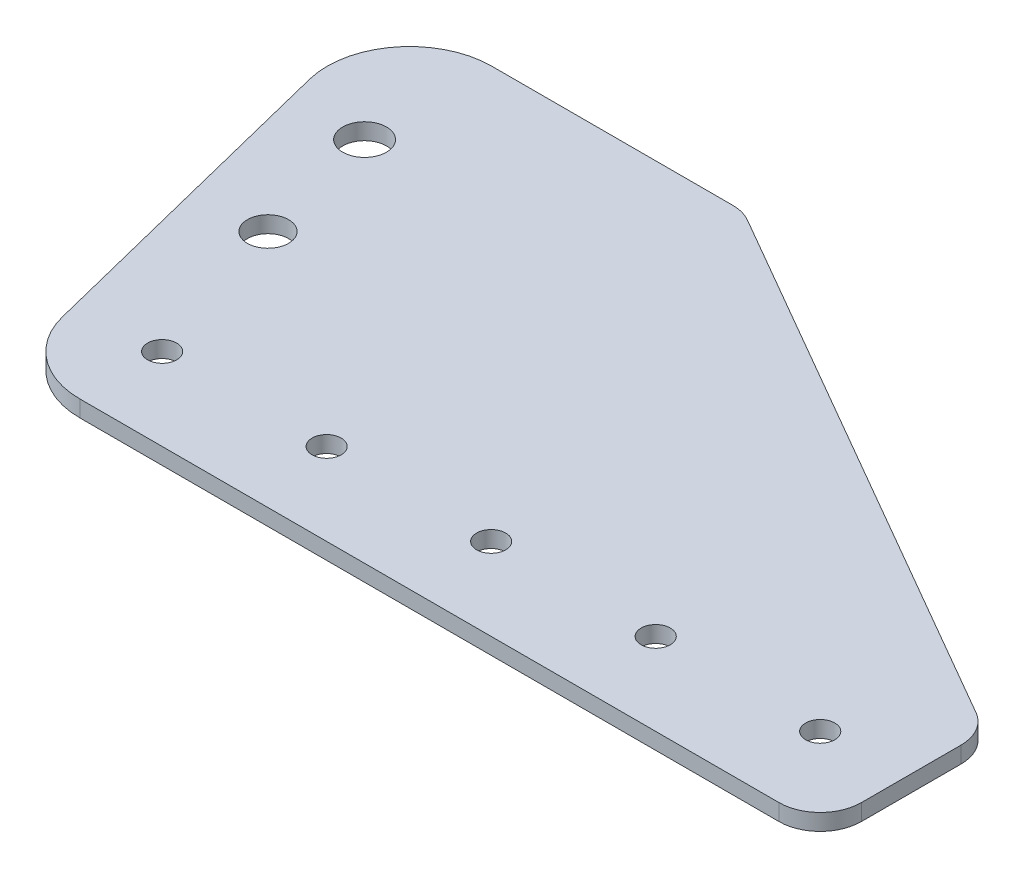
ISO-10303-21;
HEADER;
FILE_DESCRIPTION(('STEP AP214'),'2;1');
FILE_NAME('part.step','',(''),(''),'','','');
FILE_SCHEMA(('AUTOMOTIVE_DESIGN { 1 0 10303 214 1 1 1 1 }'));
ENDSEC;
DATA;
#1=APPLICATION_CONTEXT('core data for automotive mechanical design processes');
#2=APPLICATION_PROTOCOL_DEFINITION('international standard','automotive_design',2000,#1);
#3=PRODUCT_CONTEXT('',#1,'mechanical');
#4=PRODUCT('Part','Part','',(#3));
#5=PRODUCT_RELATED_PRODUCT_CATEGORY('part','',(#4));
#6=PRODUCT_DEFINITION_FORMATION('','',#4);
#7=PRODUCT_DEFINITION_CONTEXT('part definition',#1,'design');
#8=PRODUCT_DEFINITION('design','',#6,#7);
#9=PRODUCT_DEFINITION_SHAPE('','',#8);
#10=(LENGTH_UNIT() NAMED_UNIT(*) SI_UNIT(.MILLI.,.METRE.));
#11=(NAMED_UNIT(*) PLANE_ANGLE_UNIT() SI_UNIT($,.RADIAN.));
#12=(NAMED_UNIT(*) SI_UNIT($,.STERADIAN.) SOLID_ANGLE_UNIT());
#13=UNCERTAINTY_MEASURE_WITH_UNIT(LENGTH_MEASURE(1.E-05),#10,'distance_accuracy_value','');
#14=(GEOMETRIC_REPRESENTATION_CONTEXT(3) GLOBAL_UNCERTAINTY_ASSIGNED_CONTEXT((#13)) GLOBAL_UNIT_ASSIGNED_CONTEXT((#10,
#11,#12)) REPRESENTATION_CONTEXT('',''));
#15=CARTESIAN_POINT('',(0.,0.,0.));
#16=DIRECTION('',(0.,0.,1.));
#17=DIRECTION('',(1.,0.,0.));
#18=AXIS2_PLACEMENT_3D('',#15,#16,#17);
#19=CARTESIAN_POINT('',(127.,2.54,12.6999999999827));
#20=DIRECTION('',(-1.,0.,0.));
#21=DIRECTION('',(0.,0.,1.));
#22=AXIS2_PLACEMENT_3D('',#19,#20,#21);
#23=PLANE('',#22);
#24=DIRECTION('',(0.,0.,-1.));
#25=VECTOR('',#24,1.);
#26=CARTESIAN_POINT('',(127.,2.54,12.6999999999827));
#27=LINE('',#26,#25);
#28=CARTESIAN_POINT('',(127.,2.54,6.34999999998268));
#29=VERTEX_POINT('',#28);
#30=CARTESIAN_POINT('',(127.,2.54,-9.03382579066318));
#31=VERTEX_POINT('',#30);
#32=EDGE_CURVE('E204',#29,#31,#27,.T.);
#33=ORIENTED_EDGE('',*,*,#32,.F.);
#34=DIRECTION('',(0.,-1.,0.));
#35=VECTOR('',#34,1.);
#36=CARTESIAN_POINT('',(127.,2.54,6.34999999998268));
#37=LINE('',#36,#35);
#38=CARTESIAN_POINT('',(127.,0.,6.34999999998268));
#39=VERTEX_POINT('',#38);
#40=EDGE_CURVE('E216',#29,#39,#37,.T.);
#41=ORIENTED_EDGE('',*,*,#40,.T.);
#42=DIRECTION('',(0.,0.,-1.));
#43=VECTOR('',#42,1.);
#44=CARTESIAN_POINT('',(127.,0.,12.6999999999827));
#45=LINE('',#44,#43);
#46=CARTESIAN_POINT('',(127.,0.,-9.03382579066318));
#47=VERTEX_POINT('',#46);
#48=EDGE_CURVE('E181',#39,#47,#45,.T.);
#49=ORIENTED_EDGE('',*,*,#48,.T.);
#50=DIRECTION('',(0.,-1.,0.));
#51=VECTOR('',#50,1.);
#52=CARTESIAN_POINT('',(127.,2.54,-9.03382579066318));
#53=LINE('',#52,#51);
#54=EDGE_CURVE('E158',#47,#31,#53,.F.);
#55=ORIENTED_EDGE('',*,*,#54,.T.);
#56=EDGE_LOOP('',(#33,#41,#49,#55));
#57=FACE_BOUND('',#56,.T.);
#58=ADVANCED_FACE('F41',(#57),#23,.F.);
#59=CARTESIAN_POINT('',(38.8574034597005,2.54,-63.5891518396311));
#60=DIRECTION('',(-0.499999999999995,0.,0.866025403784442));
#61=DIRECTION('',(0.866025403784442,0.,0.499999999999995));
#62=AXIS2_PLACEMENT_3D('',#59,#60,#61);
#63=PLANE('',#62);
#64=DIRECTION('',(-0.866025403784442,0.,-0.499999999999995));
#65=VECTOR('',#64,1.);
#66=CARTESIAN_POINT('',(38.8574034597005,2.54,-63.5891518396311));
#67=LINE('',#66,#65);
#68=CARTESIAN_POINT('',(123.825,2.54,-14.5330871046944));
#69=VERTEX_POINT('',#68);
#70=CARTESIAN_POINT('',(40.3309260877629,2.54,-62.7384131536623));
#71=VERTEX_POINT('',#70);
#72=EDGE_CURVE('E148',#69,#71,#67,.T.);
#73=ORIENTED_EDGE('',*,*,#72,.F.);
#74=DIRECTION('',(0.,-1.,0.));
#75=VECTOR('',#74,1.);
#76=CARTESIAN_POINT('',(123.825,2.54,-14.5330871046944));
#77=LINE('',#76,#75);
#78=CARTESIAN_POINT('',(123.825,0.,-14.5330871046944));
#79=VERTEX_POINT('',#78);
#80=EDGE_CURVE('E50',#69,#79,#77,.T.);
#81=ORIENTED_EDGE('',*,*,#80,.T.);
#82=DIRECTION('',(-0.866025403784442,0.,-0.499999999999995));
#83=VECTOR('',#82,1.);
#84=CARTESIAN_POINT('',(38.8574034597005,0.,-63.5891518396311));
#85=LINE('',#84,#83);
#86=CARTESIAN_POINT('',(40.3309260877629,0.,-62.7384131536623));
#87=VERTEX_POINT('',#86);
#88=EDGE_CURVE('E185',#79,#87,#85,.T.);
#89=ORIENTED_EDGE('',*,*,#88,.T.);
#90=DIRECTION('',(0.,-1.,0.));
#91=VECTOR('',#90,1.);
#92=CARTESIAN_POINT('',(40.3309260877629,2.54,-62.7384131536623));
#93=LINE('',#92,#91);
#94=EDGE_CURVE('E70',#87,#71,#93,.F.);
#95=ORIENTED_EDGE('',*,*,#94,.T.);
#96=EDGE_LOOP('',(#73,#81,#89,#95));
#97=FACE_BOUND('',#96,.T.);
#98=ADVANCED_FACE('F246',(#97),#63,.F.);
#99=CARTESIAN_POINT('',(0.,2.54,-63.5891518396311));
#100=DIRECTION('',(0.,0.,1.));
#101=DIRECTION('',(1.,0.,0.));
#102=AXIS2_PLACEMENT_3D('',#99,#100,#101);
#103=PLANE('',#102);
#104=DIRECTION('',(-1.,0.,0.));
#105=VECTOR('',#104,1.);
#106=CARTESIAN_POINT('',(0.,2.54,-63.5891518396311));
#107=LINE('',#106,#105);
#108=CARTESIAN_POINT('',(37.1559260877629,2.54,-63.5891518396311));
#109=VERTEX_POINT('',#108);
#110=CARTESIAN_POINT('',(0.,2.54,-63.5891518396311));
#111=VERTEX_POINT('',#110);
#112=EDGE_CURVE('E138',#109,#111,#107,.T.);
#113=ORIENTED_EDGE('',*,*,#112,.F.);
#114=DIRECTION('',(0.,-1.,0.));
#115=VECTOR('',#114,1.);
#116=CARTESIAN_POINT('',(37.1559260877629,2.54,-63.5891518396311));
#117=LINE('',#116,#115);
#118=CARTESIAN_POINT('',(37.1559260877629,0.,-63.5891518396311));
#119=VERTEX_POINT('',#118);
#120=EDGE_CURVE('E11',#109,#119,#117,.T.);
#121=ORIENTED_EDGE('',*,*,#120,.T.);
#122=DIRECTION('',(-1.,0.,0.));
#123=VECTOR('',#122,1.);
#124=CARTESIAN_POINT('',(0.,0.,-63.5891518396311));
#125=LINE('',#124,#123);
#126=CARTESIAN_POINT('',(0.,0.,-63.5891518396311));
#127=VERTEX_POINT('',#126);
#128=EDGE_CURVE('E154',#119,#127,#125,.T.);
#129=ORIENTED_EDGE('',*,*,#128,.T.);
#130=DIRECTION('',(0.,-1.,0.));
#131=VECTOR('',#130,1.);
#132=CARTESIAN_POINT('',(0.,2.54,-63.5891518396311));
#133=LINE('',#132,#131);
#134=EDGE_CURVE('E151',#111,#127,#133,.T.);
#135=ORIENTED_EDGE('',*,*,#134,.F.);
#136=EDGE_LOOP('',(#113,#121,#129,#135));
#137=FACE_BOUND('',#136,.T.);
#138=ADVANCED_FACE('F152',(#137),#103,.F.);
#139=CARTESIAN_POINT('',(0.,2.54,-50.8891518396311));
#140=DIRECTION('',(0.,-1.,0.));
#141=DIRECTION('',(0.,0.,-1.));
#142=AXIS2_PLACEMENT_3D('',#139,#140,#141);
#143=CYLINDRICAL_SURFACE('',#142,12.7);
#144=CARTESIAN_POINT('',(0.,0.,-50.8891518396311));
#145=DIRECTION('',(0.,1.,0.));
#146=DIRECTION('',(0.,0.,1.));
#147=AXIS2_PLACEMENT_3D('',#144,#145,#146);
#148=CIRCLE('',#147,12.7);
#149=CARTESIAN_POINT('',(-12.3220785189887,0.,-47.8140289198316));
#150=VERTEX_POINT('',#149);
#151=EDGE_CURVE('E191',#127,#150,#148,.T.);
#152=ORIENTED_EDGE('',*,*,#151,.T.);
#153=DIRECTION('',(0.,-1.,0.));
#154=VECTOR('',#153,1.);
#155=CARTESIAN_POINT('',(-12.3220785189887,2.54,-47.8140289198316));
#156=LINE('',#155,#154);
#157=CARTESIAN_POINT('',(-12.3220785189887,2.54,-47.8140289198316));
#158=VERTEX_POINT('',#157);
#159=EDGE_CURVE('E159',#158,#150,#156,.T.);
#160=ORIENTED_EDGE('',*,*,#159,.F.);
#161=CARTESIAN_POINT('',(0.,2.54,-50.8891518396311));
#162=DIRECTION('',(0.,1.,0.));
#163=DIRECTION('',(0.,0.,1.));
#164=AXIS2_PLACEMENT_3D('',#161,#162,#163);
#165=CIRCLE('',#164,12.7);
#166=EDGE_CURVE('E143',#111,#158,#165,.T.);
#167=ORIENTED_EDGE('',*,*,#166,.F.);
#168=ORIENTED_EDGE('',*,*,#134,.T.);
#169=EDGE_LOOP('',(#152,#160,#167,#168));
#170=FACE_BOUND('',#169,.T.);
#171=ADVANCED_FACE('F161',(#170),#143,.T.);
#172=CARTESIAN_POINT('',(-12.3220785189887,2.54,-47.8140289198316));
#173=DIRECTION('',(0.970242403069978,0.,-0.242135662976344));
#174=DIRECTION('',(-0.242135662976344,0.,-0.970242403069978));
#175=AXIS2_PLACEMENT_3D('',#172,#173,#174);
#176=PLANE('',#175);
#177=DIRECTION('',(0.242135662976344,0.,0.970242403069978));
#178=VECTOR('',#177,1.);
#179=CARTESIAN_POINT('',(-12.3220785189887,0.,-47.8140289198316));
#180=LINE('',#179,#178);
#181=CARTESIAN_POINT('',(0.377921481011272,0.,3.07512291978227));
#182=VERTEX_POINT('',#181);
#183=EDGE_CURVE('E194',#150,#182,#180,.T.);
#184=ORIENTED_EDGE('',*,*,#183,.T.);
#185=DIRECTION('',(0.,-1.,0.));
#186=VECTOR('',#185,1.);
#187=CARTESIAN_POINT('',(0.377921481011272,2.54,3.07512291978227));
#188=LINE('',#187,#186);
#189=CARTESIAN_POINT('',(0.377921481011272,2.54,3.07512291978227));
#190=VERTEX_POINT('',#189);
#191=EDGE_CURVE('E208',#190,#182,#188,.T.);
#192=ORIENTED_EDGE('',*,*,#191,.F.);
#193=DIRECTION('',(0.242135662976344,0.,0.970242403069978));
#194=VECTOR('',#193,1.);
#195=CARTESIAN_POINT('',(-12.3220785189887,2.54,-47.8140289198316));
#196=LINE('',#195,#194);
#197=EDGE_CURVE('E165',#158,#190,#196,.T.);
#198=ORIENTED_EDGE('',*,*,#197,.F.);
#199=ORIENTED_EDGE('',*,*,#159,.T.);
#200=EDGE_LOOP('',(#184,#192,#198,#199));
#201=FACE_BOUND('',#200,.T.);
#202=ADVANCED_FACE('F388',(#201),#176,.F.);
#203=CARTESIAN_POINT('',(12.7,2.54,-1.73056013963446E-11));
#204=DIRECTION('',(0.,-1.,0.));
#205=DIRECTION('',(0.,0.,-1.));
#206=AXIS2_PLACEMENT_3D('',#203,#204,#205);
#207=CYLINDRICAL_SURFACE('',#206,12.7);
#208=CARTESIAN_POINT('',(12.7,0.,-1.73056013963446E-11));
#209=DIRECTION('',(0.,1.,0.));
#210=DIRECTION('',(0.,0.,-1.));
#211=AXIS2_PLACEMENT_3D('',#208,#209,#210);
#212=CIRCLE('',#211,12.7);
#213=CARTESIAN_POINT('',(12.7,0.,12.6999999999827));
#214=VERTEX_POINT('',#213);
#215=EDGE_CURVE('E197',#182,#214,#212,.T.);
#216=ORIENTED_EDGE('',*,*,#215,.T.);
#217=DIRECTION('',(0.,-1.,0.));
#218=VECTOR('',#217,1.);
#219=CARTESIAN_POINT('',(12.7,2.54,12.6999999999827));
#220=LINE('',#219,#218);
#221=CARTESIAN_POINT('',(12.7,2.54,12.6999999999827));
#222=VERTEX_POINT('',#221);
#223=EDGE_CURVE('E180',#222,#214,#220,.T.);
#224=ORIENTED_EDGE('',*,*,#223,.F.);
#225=CARTESIAN_POINT('',(12.7,2.54,-1.73056013963446E-11));
#226=DIRECTION('',(0.,1.,0.));
#227=DIRECTION('',(0.,0.,-1.));
#228=AXIS2_PLACEMENT_3D('',#225,#226,#227);
#229=CIRCLE('',#228,12.7);
#230=EDGE_CURVE('E171',#190,#222,#229,.T.);
#231=ORIENTED_EDGE('',*,*,#230,.F.);
#232=ORIENTED_EDGE('',*,*,#191,.T.);
#233=EDGE_LOOP('',(#216,#224,#231,#232));
#234=FACE_BOUND('',#233,.T.);
#235=ADVANCED_FACE('F384',(#234),#207,.T.);
#236=CARTESIAN_POINT('',(127.,2.54,12.6999999999827));
#237=DIRECTION('',(0.,0.,-1.));
#238=DIRECTION('',(-1.,0.,0.));
#239=AXIS2_PLACEMENT_3D('',#236,#237,#238);
#240=PLANE('',#239);
#241=DIRECTION('',(1.,0.,0.));
#242=VECTOR('',#241,1.);
#243=CARTESIAN_POINT('',(127.,0.,12.6999999999827));
#244=LINE('',#243,#242);
#245=CARTESIAN_POINT('',(120.65,0.,12.6999999999827));
#246=VERTEX_POINT('',#245);
#247=EDGE_CURVE('E200',#214,#246,#244,.T.);
#248=ORIENTED_EDGE('',*,*,#247,.T.);
#249=DIRECTION('',(0.,-1.,0.));
#250=VECTOR('',#249,1.);
#251=CARTESIAN_POINT('',(120.65,2.54,12.6999999999827));
#252=LINE('',#251,#250);
#253=CARTESIAN_POINT('',(120.65,2.54,12.6999999999827));
#254=VERTEX_POINT('',#253);
#255=EDGE_CURVE('E229',#246,#254,#252,.F.);
#256=ORIENTED_EDGE('',*,*,#255,.T.);
#257=DIRECTION('',(1.,0.,0.));
#258=VECTOR('',#257,1.);
#259=CARTESIAN_POINT('',(127.,2.54,12.6999999999827));
#260=LINE('',#259,#258);
#261=EDGE_CURVE('E177',#222,#254,#260,.T.);
#262=ORIENTED_EDGE('',*,*,#261,.F.);
#263=ORIENTED_EDGE('',*,*,#223,.T.);
#264=EDGE_LOOP('',(#248,#256,#262,#263));
#265=FACE_BOUND('',#264,.T.);
#266=ADVANCED_FACE('F352',(#265),#240,.F.);
#267=CARTESIAN_POINT('',(0.,2.54,-50.8891518396311));
#268=DIRECTION('',(0.,1.,0.));
#269=DIRECTION('',(0.,0.,1.));
#270=AXIS2_PLACEMENT_3D('',#267,#268,#269);
#271=PLANE('',#270);
#272=CARTESIAN_POINT('',(4.83277956991413,2.54,-24.2097000285141));
#273=DIRECTION('',(0.,1.,0.));
#274=DIRECTION('',(0.,0.,1.));
#275=AXIS2_PLACEMENT_3D('',#272,#273,#274);
#276=CIRCLE('',#275,3.175);
#277=CARTESIAN_POINT('',(4.83277956991413,2.54,-21.0347000285141));
#278=VERTEX_POINT('',#277);
#279=EDGE_CURVE('E338',#278,#278,#276,.T.);
#280=ORIENTED_EDGE('',*,*,#279,.F.);
#281=EDGE_LOOP('',(#280));
#282=FACE_BOUND('',#281,.T.);
#283=CARTESIAN_POINT('',(12.7,2.54,-1.73056013963446E-11));
#284=DIRECTION('',(0.,1.,0.));
#285=DIRECTION('',(0.,0.,1.));
#286=AXIS2_PLACEMENT_3D('',#283,#284,#285);
#287=CIRCLE('',#286,2.24789999999999);
#288=CARTESIAN_POINT('',(12.7,2.54,2.24789999998268));
#289=VERTEX_POINT('',#288);
#290=EDGE_CURVE('E333',#289,#289,#287,.T.);
#291=ORIENTED_EDGE('',*,*,#290,.F.);
#292=EDGE_LOOP('',(#291));
#293=FACE_BOUND('',#292,.T.);
#294=CARTESIAN_POINT('',(38.1,2.54,-1.73056013963446E-11));
#295=DIRECTION('',(0.,1.,0.));
#296=DIRECTION('',(0.,0.,1.));
#297=AXIS2_PLACEMENT_3D('',#294,#295,#296);
#298=CIRCLE('',#297,2.24789999999998);
#299=CARTESIAN_POINT('',(38.1,2.54,2.24789999998268));
#300=VERTEX_POINT('',#299);
#301=EDGE_CURVE('E325',#300,#300,#298,.T.);
#302=ORIENTED_EDGE('',*,*,#301,.F.);
#303=EDGE_LOOP('',(#302));
#304=FACE_BOUND('',#303,.T.);
#305=CARTESIAN_POINT('',(63.5,2.54,-1.73056013963446E-11));
#306=DIRECTION('',(0.,1.,0.));
#307=DIRECTION('',(0.,0.,1.));
#308=AXIS2_PLACEMENT_3D('',#305,#306,#307);
#309=CIRCLE('',#308,2.24789999999998);
#310=CARTESIAN_POINT('',(63.5,2.54,2.24789999998268));
#311=VERTEX_POINT('',#310);
#312=EDGE_CURVE('E317',#311,#311,#309,.T.);
#313=ORIENTED_EDGE('',*,*,#312,.F.);
#314=EDGE_LOOP('',(#313));
#315=FACE_BOUND('',#314,.T.);
#316=CARTESIAN_POINT('',(88.9,2.54,-1.73056013963446E-11));
#317=DIRECTION('',(0.,1.,0.));
#318=DIRECTION('',(0.,0.,1.));
#319=AXIS2_PLACEMENT_3D('',#316,#317,#318);
#320=CIRCLE('',#319,2.24789999999998);
#321=CARTESIAN_POINT('',(88.9,2.54,2.24789999998268));
#322=VERTEX_POINT('',#321);
#323=EDGE_CURVE('E309',#322,#322,#320,.T.);
#324=ORIENTED_EDGE('',*,*,#323,.F.);
#325=EDGE_LOOP('',(#324));
#326=FACE_BOUND('',#325,.T.);
#327=CARTESIAN_POINT('',(114.3,2.54,-1.73056013963446E-11));
#328=DIRECTION('',(0.,1.,0.));
#329=DIRECTION('',(0.,0.,1.));
#330=AXIS2_PLACEMENT_3D('',#327,#328,#329);
#331=CIRCLE('',#330,2.24789999999998);
#332=CARTESIAN_POINT('',(114.3,2.54,2.24789999998268));
#333=VERTEX_POINT('',#332);
#334=EDGE_CURVE('E301',#333,#333,#331,.T.);
#335=ORIENTED_EDGE('',*,*,#334,.F.);
#336=EDGE_LOOP('',(#335));
#337=FACE_BOUND('',#336,.T.);
#338=CARTESIAN_POINT('',(0.,2.54,-43.956848344882));
#339=DIRECTION('',(0.,1.,0.));
#340=DIRECTION('',(0.,0.,1.));
#341=AXIS2_PLACEMENT_3D('',#338,#339,#340);
#342=CIRCLE('',#341,3.3782);
#343=CARTESIAN_POINT('',(0.,2.54,-40.578648344882));
#344=VERTEX_POINT('',#343);
#345=EDGE_CURVE('E294',#344,#344,#342,.T.);
#346=ORIENTED_EDGE('',*,*,#345,.F.);
#347=EDGE_LOOP('',(#346));
#348=FACE_BOUND('',#347,.T.);
#349=ORIENTED_EDGE('',*,*,#261,.T.);
#350=CARTESIAN_POINT('',(120.65,2.54,6.34999999998268));
#351=DIRECTION('',(0.,1.,0.));
#352=DIRECTION('',(0.,0.,1.));
#353=AXIS2_PLACEMENT_3D('',#350,#351,#352);
#354=CIRCLE('',#353,6.35);
#355=EDGE_CURVE('E237',#254,#29,#354,.T.);
#356=ORIENTED_EDGE('',*,*,#355,.T.);
#357=ORIENTED_EDGE('',*,*,#32,.T.);
#358=CARTESIAN_POINT('',(120.65,2.54,-9.03382579066318));
#359=DIRECTION('',(0.,1.,0.));
#360=DIRECTION('',(0.,0.,1.));
#361=AXIS2_PLACEMENT_3D('',#358,#359,#360);
#362=CIRCLE('',#361,6.35);
#363=EDGE_CURVE('E234',#31,#69,#362,.T.);
#364=ORIENTED_EDGE('',*,*,#363,.T.);
#365=ORIENTED_EDGE('',*,*,#72,.T.);
#366=CARTESIAN_POINT('',(37.1559260877629,2.54,-57.2391518396311));
#367=DIRECTION('',(0.,1.,0.));
#368=DIRECTION('',(0.,0.,1.));
#369=AXIS2_PLACEMENT_3D('',#366,#367,#368);
#370=CIRCLE('',#369,6.35);
#371=EDGE_CURVE('E60',#71,#109,#370,.T.);
#372=ORIENTED_EDGE('',*,*,#371,.T.);
#373=ORIENTED_EDGE('',*,*,#112,.T.);
#374=ORIENTED_EDGE('',*,*,#166,.T.);
#375=ORIENTED_EDGE('',*,*,#197,.T.);
#376=ORIENTED_EDGE('',*,*,#230,.T.);
#377=EDGE_LOOP('',(#349,#356,#357,#364,#365,#372,#373,#374,#375,#376));
#378=FACE_BOUND('',#377,.T.);
#379=ADVANCED_FACE('F141',(#282,#293,#304,#315,#326,#337,#348,#378),#271,.T.);
#380=CARTESIAN_POINT('',(0.,0.,-50.8891518396311));
#381=DIRECTION('',(0.,1.,0.));
#382=DIRECTION('',(0.,0.,1.));
#383=AXIS2_PLACEMENT_3D('',#380,#381,#382);
#384=PLANE('',#383);
#385=CARTESIAN_POINT('',(4.83277956991413,0.,-24.2097000285141));
#386=DIRECTION('',(0.,1.,0.));
#387=DIRECTION('',(0.,0.,1.));
#388=AXIS2_PLACEMENT_3D('',#385,#386,#387);
#389=CIRCLE('',#388,3.175);
#390=CARTESIAN_POINT('',(4.83277956991413,0.,-21.0347000285141));
#391=VERTEX_POINT('',#390);
#392=EDGE_CURVE('E337',#391,#391,#389,.T.);
#393=ORIENTED_EDGE('',*,*,#392,.T.);
#394=EDGE_LOOP('',(#393));
#395=FACE_BOUND('',#394,.T.);
#396=CARTESIAN_POINT('',(12.7,0.,-1.73056013963446E-11));
#397=DIRECTION('',(0.,1.,0.));
#398=DIRECTION('',(0.,0.,1.));
#399=AXIS2_PLACEMENT_3D('',#396,#397,#398);
#400=CIRCLE('',#399,2.24789999999999);
#401=CARTESIAN_POINT('',(12.7,0.,2.24789999998268));
#402=VERTEX_POINT('',#401);
#403=EDGE_CURVE('E329',#402,#402,#400,.T.);
#404=ORIENTED_EDGE('',*,*,#403,.T.);
#405=EDGE_LOOP('',(#404));
#406=FACE_BOUND('',#405,.T.);
#407=CARTESIAN_POINT('',(38.1,0.,-1.73056013963446E-11));
#408=DIRECTION('',(0.,1.,0.));
#409=DIRECTION('',(0.,0.,1.));
#410=AXIS2_PLACEMENT_3D('',#407,#408,#409);
#411=CIRCLE('',#410,2.24789999999998);
#412=CARTESIAN_POINT('',(38.1,0.,2.24789999998268));
#413=VERTEX_POINT('',#412);
#414=EDGE_CURVE('E321',#413,#413,#411,.T.);
#415=ORIENTED_EDGE('',*,*,#414,.T.);
#416=EDGE_LOOP('',(#415));
#417=FACE_BOUND('',#416,.T.);
#418=CARTESIAN_POINT('',(63.5,0.,-1.73056013963446E-11));
#419=DIRECTION('',(0.,1.,0.));
#420=DIRECTION('',(0.,0.,1.));
#421=AXIS2_PLACEMENT_3D('',#418,#419,#420);
#422=CIRCLE('',#421,2.24789999999998);
#423=CARTESIAN_POINT('',(63.5,0.,2.24789999998268));
#424=VERTEX_POINT('',#423);
#425=EDGE_CURVE('E313',#424,#424,#422,.T.);
#426=ORIENTED_EDGE('',*,*,#425,.T.);
#427=EDGE_LOOP('',(#426));
#428=FACE_BOUND('',#427,.T.);
#429=CARTESIAN_POINT('',(88.9,0.,-1.73056013963446E-11));
#430=DIRECTION('',(0.,1.,0.));
#431=DIRECTION('',(0.,0.,1.));
#432=AXIS2_PLACEMENT_3D('',#429,#430,#431);
#433=CIRCLE('',#432,2.24789999999998);
#434=CARTESIAN_POINT('',(88.9,0.,2.24789999998268));
#435=VERTEX_POINT('',#434);
#436=EDGE_CURVE('E305',#435,#435,#433,.T.);
#437=ORIENTED_EDGE('',*,*,#436,.T.);
#438=EDGE_LOOP('',(#437));
#439=FACE_BOUND('',#438,.T.);
#440=CARTESIAN_POINT('',(114.3,0.,-1.73056013963446E-11));
#441=DIRECTION('',(0.,1.,0.));
#442=DIRECTION('',(0.,0.,1.));
#443=AXIS2_PLACEMENT_3D('',#440,#441,#442);
#444=CIRCLE('',#443,2.24789999999998);
#445=CARTESIAN_POINT('',(114.3,0.,2.24789999998268));
#446=VERTEX_POINT('',#445);
#447=EDGE_CURVE('E297',#446,#446,#444,.T.);
#448=ORIENTED_EDGE('',*,*,#447,.T.);
#449=EDGE_LOOP('',(#448));
#450=FACE_BOUND('',#449,.T.);
#451=CARTESIAN_POINT('',(0.,0.,-43.956848344882));
#452=DIRECTION('',(0.,1.,0.));
#453=DIRECTION('',(0.,0.,1.));
#454=AXIS2_PLACEMENT_3D('',#451,#452,#453);
#455=CIRCLE('',#454,3.3782);
#456=CARTESIAN_POINT('',(0.,0.,-40.578648344882));
#457=VERTEX_POINT('',#456);
#458=EDGE_CURVE('E186',#457,#457,#455,.T.);
#459=ORIENTED_EDGE('',*,*,#458,.T.);
#460=EDGE_LOOP('',(#459));
#461=FACE_BOUND('',#460,.T.);
#462=ORIENTED_EDGE('',*,*,#48,.F.);
#463=CARTESIAN_POINT('',(120.65,0.,6.34999999998268));
#464=DIRECTION('',(0.,1.,0.));
#465=DIRECTION('',(0.,0.,1.));
#466=AXIS2_PLACEMENT_3D('',#463,#464,#465);
#467=CIRCLE('',#466,6.35);
#468=EDGE_CURVE('E226',#39,#246,#467,.F.);
#469=ORIENTED_EDGE('',*,*,#468,.T.);
#470=ORIENTED_EDGE('',*,*,#247,.F.);
#471=ORIENTED_EDGE('',*,*,#215,.F.);
#472=ORIENTED_EDGE('',*,*,#183,.F.);
#473=ORIENTED_EDGE('',*,*,#151,.F.);
#474=ORIENTED_EDGE('',*,*,#128,.F.);
#475=CARTESIAN_POINT('',(37.1559260877629,0.,-57.2391518396311));
#476=DIRECTION('',(0.,1.,0.));
#477=DIRECTION('',(0.,0.,1.));
#478=AXIS2_PLACEMENT_3D('',#475,#476,#477);
#479=CIRCLE('',#478,6.35);
#480=EDGE_CURVE('E220',#119,#87,#479,.F.);
#481=ORIENTED_EDGE('',*,*,#480,.T.);
#482=ORIENTED_EDGE('',*,*,#88,.F.);
#483=CARTESIAN_POINT('',(120.65,0.,-9.03382579066318));
#484=DIRECTION('',(0.,1.,0.));
#485=DIRECTION('',(0.,0.,1.));
#486=AXIS2_PLACEMENT_3D('',#483,#484,#485);
#487=CIRCLE('',#486,6.35);
#488=EDGE_CURVE('E223',#79,#47,#487,.F.);
#489=ORIENTED_EDGE('',*,*,#488,.T.);
#490=EDGE_LOOP('',(#462,#469,#470,#471,#472,#473,#474,#481,#482,#489));
#491=FACE_BOUND('',#490,.T.);
#492=ADVANCED_FACE('F251',(#395,#406,#417,#428,#439,#450,#461,#491),#384,.F.);
#493=CARTESIAN_POINT('',(0.,2.54,-43.956848344882));
#494=DIRECTION('',(0.,1.,0.));
#495=DIRECTION('',(0.,0.,1.));
#496=AXIS2_PLACEMENT_3D('',#493,#494,#495);
#497=CYLINDRICAL_SURFACE('',#496,3.3782);
#498=ORIENTED_EDGE('',*,*,#458,.F.);
#499=EDGE_LOOP('',(#498));
#500=FACE_BOUND('',#499,.T.);
#501=ORIENTED_EDGE('',*,*,#345,.T.);
#502=EDGE_LOOP('',(#501));
#503=FACE_BOUND('',#502,.T.);
#504=ADVANCED_FACE('F366',(#500,#503),#497,.F.);
#505=CARTESIAN_POINT('',(114.3,2.54,-1.73056013963446E-11));
#506=DIRECTION('',(0.,1.,0.));
#507=DIRECTION('',(0.,0.,1.));
#508=AXIS2_PLACEMENT_3D('',#505,#506,#507);
#509=CYLINDRICAL_SURFACE('',#508,2.24789999999998);
#510=ORIENTED_EDGE('',*,*,#447,.F.);
#511=EDGE_LOOP('',(#510));
#512=FACE_BOUND('',#511,.T.);
#513=ORIENTED_EDGE('',*,*,#334,.T.);
#514=EDGE_LOOP('',(#513));
#515=FACE_BOUND('',#514,.T.);
#516=ADVANCED_FACE('F368',(#512,#515),#509,.F.);
#517=CARTESIAN_POINT('',(88.9,2.54,-1.73056013963446E-11));
#518=DIRECTION('',(0.,1.,0.));
#519=DIRECTION('',(0.,0.,1.));
#520=AXIS2_PLACEMENT_3D('',#517,#518,#519);
#521=CYLINDRICAL_SURFACE('',#520,2.24789999999998);
#522=ORIENTED_EDGE('',*,*,#436,.F.);
#523=EDGE_LOOP('',(#522));
#524=FACE_BOUND('',#523,.T.);
#525=ORIENTED_EDGE('',*,*,#323,.T.);
#526=EDGE_LOOP('',(#525));
#527=FACE_BOUND('',#526,.T.);
#528=ADVANCED_FACE('F375',(#524,#527),#521,.F.);
#529=CARTESIAN_POINT('',(63.5,2.54,-1.73056013963446E-11));
#530=DIRECTION('',(0.,1.,0.));
#531=DIRECTION('',(0.,0.,1.));
#532=AXIS2_PLACEMENT_3D('',#529,#530,#531);
#533=CYLINDRICAL_SURFACE('',#532,2.24789999999998);
#534=ORIENTED_EDGE('',*,*,#425,.F.);
#535=EDGE_LOOP('',(#534));
#536=FACE_BOUND('',#535,.T.);
#537=ORIENTED_EDGE('',*,*,#312,.T.);
#538=EDGE_LOOP('',(#537));
#539=FACE_BOUND('',#538,.T.);
#540=ADVANCED_FACE('F487',(#536,#539),#533,.F.);
#541=CARTESIAN_POINT('',(38.1,2.54,-1.73056013963446E-11));
#542=DIRECTION('',(0.,1.,0.));
#543=DIRECTION('',(0.,0.,1.));
#544=AXIS2_PLACEMENT_3D('',#541,#542,#543);
#545=CYLINDRICAL_SURFACE('',#544,2.24789999999998);
#546=ORIENTED_EDGE('',*,*,#414,.F.);
#547=EDGE_LOOP('',(#546));
#548=FACE_BOUND('',#547,.T.);
#549=ORIENTED_EDGE('',*,*,#301,.T.);
#550=EDGE_LOOP('',(#549));
#551=FACE_BOUND('',#550,.T.);
#552=ADVANCED_FACE('F279',(#548,#551),#545,.F.);
#553=CARTESIAN_POINT('',(12.7,2.54,-1.73056013963446E-11));
#554=DIRECTION('',(0.,1.,0.));
#555=DIRECTION('',(0.,0.,1.));
#556=AXIS2_PLACEMENT_3D('',#553,#554,#555);
#557=CYLINDRICAL_SURFACE('',#556,2.24789999999999);
#558=ORIENTED_EDGE('',*,*,#403,.F.);
#559=EDGE_LOOP('',(#558));
#560=FACE_BOUND('',#559,.T.);
#561=ORIENTED_EDGE('',*,*,#290,.T.);
#562=EDGE_LOOP('',(#561));
#563=FACE_BOUND('',#562,.T.);
#564=ADVANCED_FACE('F274',(#560,#563),#557,.F.);
#565=CARTESIAN_POINT('',(120.65,2.54,6.34999999998268));
#566=DIRECTION('',(0.,-1.,0.));
#567=DIRECTION('',(0.,0.,-1.));
#568=AXIS2_PLACEMENT_3D('',#565,#566,#567);
#569=CYLINDRICAL_SURFACE('',#568,6.35);
#570=ORIENTED_EDGE('',*,*,#355,.F.);
#571=ORIENTED_EDGE('',*,*,#255,.F.);
#572=ORIENTED_EDGE('',*,*,#468,.F.);
#573=ORIENTED_EDGE('',*,*,#40,.F.);
#574=EDGE_LOOP('',(#570,#571,#572,#573));
#575=FACE_BOUND('',#574,.T.);
#576=ADVANCED_FACE('F262',(#575),#569,.T.);
#577=CARTESIAN_POINT('',(120.65,2.54,-9.03382579066318));
#578=DIRECTION('',(0.,-1.,0.));
#579=DIRECTION('',(0.,0.,-1.));
#580=AXIS2_PLACEMENT_3D('',#577,#578,#579);
#581=CYLINDRICAL_SURFACE('',#580,6.35);
#582=ORIENTED_EDGE('',*,*,#363,.F.);
#583=ORIENTED_EDGE('',*,*,#54,.F.);
#584=ORIENTED_EDGE('',*,*,#488,.F.);
#585=ORIENTED_EDGE('',*,*,#80,.F.);
#586=EDGE_LOOP('',(#582,#583,#584,#585));
#587=FACE_BOUND('',#586,.T.);
#588=ADVANCED_FACE('F255',(#587),#581,.T.);
#589=CARTESIAN_POINT('',(37.1559260877629,2.54,-57.2391518396311));
#590=DIRECTION('',(0.,-1.,0.));
#591=DIRECTION('',(0.,0.,-1.));
#592=AXIS2_PLACEMENT_3D('',#589,#590,#591);
#593=CYLINDRICAL_SURFACE('',#592,6.35);
#594=ORIENTED_EDGE('',*,*,#371,.F.);
#595=ORIENTED_EDGE('',*,*,#94,.F.);
#596=ORIENTED_EDGE('',*,*,#480,.F.);
#597=ORIENTED_EDGE('',*,*,#120,.F.);
#598=EDGE_LOOP('',(#594,#595,#596,#597));
#599=FACE_BOUND('',#598,.T.);
#600=ADVANCED_FACE('F43',(#599),#593,.T.);
#601=CARTESIAN_POINT('',(4.83277956991413,0.,-24.2097000285141));
#602=DIRECTION('',(0.,1.,0.));
#603=DIRECTION('',(0.,0.,1.));
#604=AXIS2_PLACEMENT_3D('',#601,#602,#603);
#605=CYLINDRICAL_SURFACE('',#604,3.175);
#606=ORIENTED_EDGE('',*,*,#392,.F.);
#607=EDGE_LOOP('',(#606));
#608=FACE_BOUND('',#607,.T.);
#609=ORIENTED_EDGE('',*,*,#279,.T.);
#610=EDGE_LOOP('',(#609));
#611=FACE_BOUND('',#610,.T.);
#612=ADVANCED_FACE('F254',(#608,#611),#605,.F.);
#613=CLOSED_SHELL('',(#58,#98,#138,#171,#202,#235,#266,#379,#492,#504,#516,#528,#540,#552,#564,
#576,#588,#600,#612));
#614=MANIFOLD_SOLID_BREP('B2',#613);
#615=ADVANCED_BREP_SHAPE_REPRESENTATION('',(#18,#614),#14);
#616=SHAPE_DEFINITION_REPRESENTATION(#9,#615);
ENDSEC;
END-ISO-10303-21;
